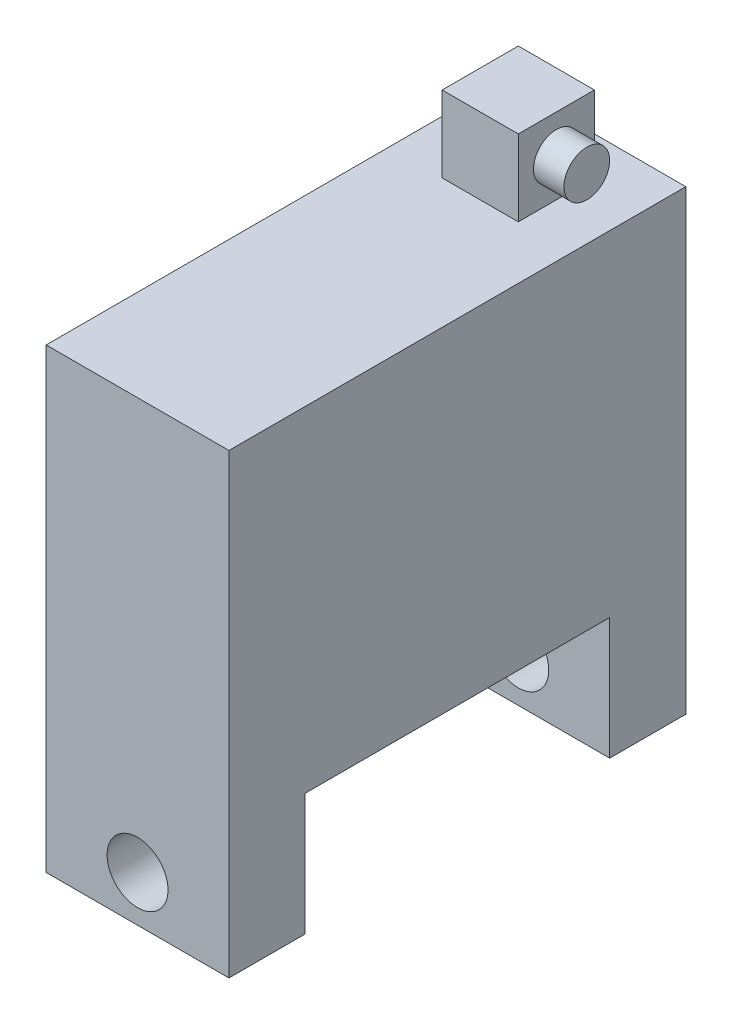
ISO-10303-21;
HEADER;
FILE_DESCRIPTION(('STEP AP214'),'2;1');
FILE_NAME('part.step','',(''),(''),'','','');
FILE_SCHEMA(('AUTOMOTIVE_DESIGN { 1 0 10303 214 1 1 1 1 }'));
ENDSEC;
DATA;
#1=APPLICATION_CONTEXT('core data for automotive mechanical design processes');
#2=APPLICATION_PROTOCOL_DEFINITION('international standard','automotive_design',2000,#1);
#3=PRODUCT_CONTEXT('',#1,'mechanical');
#4=PRODUCT('Part','Part','',(#3));
#5=PRODUCT_RELATED_PRODUCT_CATEGORY('part','',(#4));
#6=PRODUCT_DEFINITION_FORMATION('','',#4);
#7=PRODUCT_DEFINITION_CONTEXT('part definition',#1,'design');
#8=PRODUCT_DEFINITION('design','',#6,#7);
#9=PRODUCT_DEFINITION_SHAPE('','',#8);
#10=(LENGTH_UNIT() NAMED_UNIT(*) SI_UNIT(.MILLI.,.METRE.));
#11=(NAMED_UNIT(*) PLANE_ANGLE_UNIT() SI_UNIT($,.RADIAN.));
#12=(NAMED_UNIT(*) SI_UNIT($,.STERADIAN.) SOLID_ANGLE_UNIT());
#13=UNCERTAINTY_MEASURE_WITH_UNIT(LENGTH_MEASURE(1.E-05),#10,'distance_accuracy_value','');
#14=(GEOMETRIC_REPRESENTATION_CONTEXT(3) GLOBAL_UNCERTAINTY_ASSIGNED_CONTEXT((#13)) GLOBAL_UNIT_ASSIGNED_CONTEXT((#10,
#11,#12)) REPRESENTATION_CONTEXT('',''));
#15=CARTESIAN_POINT('',(0.,0.,0.));
#16=DIRECTION('',(0.,0.,1.));
#17=DIRECTION('',(1.,0.,0.));
#18=AXIS2_PLACEMENT_3D('',#15,#16,#17);
#19=CARTESIAN_POINT('',(0.,150.,0.));
#20=DIRECTION('',(0.,-1.,0.));
#21=DIRECTION('',(0.,0.,-1.));
#22=AXIS2_PLACEMENT_3D('',#19,#20,#21);
#23=PLANE('',#22);
#24=DIRECTION('',(1.,0.,0.));
#25=VECTOR('',#24,1.);
#26=CARTESIAN_POINT('',(-30.,150.,75.));
#27=LINE('',#26,#25);
#28=CARTESIAN_POINT('',(-30.,150.,75.));
#29=VERTEX_POINT('',#28);
#30=CARTESIAN_POINT('',(30.,150.,75.));
#31=VERTEX_POINT('',#30);
#32=EDGE_CURVE('E184',#29,#31,#27,.T.);
#33=ORIENTED_EDGE('',*,*,#32,.T.);
#34=DIRECTION('',(0.,0.,1.));
#35=VECTOR('',#34,1.);
#36=CARTESIAN_POINT('',(30.,150.,-75.));
#37=LINE('',#36,#35);
#38=CARTESIAN_POINT('',(30.,150.,-75.));
#39=VERTEX_POINT('',#38);
#40=EDGE_CURVE('E186',#39,#31,#37,.T.);
#41=ORIENTED_EDGE('',*,*,#40,.F.);
#42=DIRECTION('',(1.,0.,0.));
#43=VECTOR('',#42,1.);
#44=CARTESIAN_POINT('',(-30.,150.,-75.));
#45=LINE('',#44,#43);
#46=CARTESIAN_POINT('',(-30.,150.,-75.));
#47=VERTEX_POINT('',#46);
#48=EDGE_CURVE('E190',#47,#39,#45,.T.);
#49=ORIENTED_EDGE('',*,*,#48,.F.);
#50=DIRECTION('',(0.,0.,1.));
#51=VECTOR('',#50,1.);
#52=CARTESIAN_POINT('',(-30.,150.,-75.));
#53=LINE('',#52,#51);
#54=EDGE_CURVE('E193',#47,#29,#53,.T.);
#55=ORIENTED_EDGE('',*,*,#54,.T.);
#56=EDGE_LOOP('',(#33,#41,#49,#55));
#57=FACE_BOUND('',#56,.T.);
#58=DIRECTION('',(0.,0.,-1.));
#59=VECTOR('',#58,1.);
#60=CARTESIAN_POINT('',(12.5,150.,-62.5));
#61=LINE('',#60,#59);
#62=CARTESIAN_POINT('',(12.5,150.,-37.5));
#63=VERTEX_POINT('',#62);
#64=CARTESIAN_POINT('',(12.5,150.,-62.5));
#65=VERTEX_POINT('',#64);
#66=EDGE_CURVE('E146',#63,#65,#61,.T.);
#67=ORIENTED_EDGE('',*,*,#66,.F.);
#68=DIRECTION('',(1.,0.,0.));
#69=VECTOR('',#68,1.);
#70=CARTESIAN_POINT('',(-12.5,150.,-37.5));
#71=LINE('',#70,#69);
#72=CARTESIAN_POINT('',(-12.5,150.,-37.5));
#73=VERTEX_POINT('',#72);
#74=EDGE_CURVE('E143',#73,#63,#71,.T.);
#75=ORIENTED_EDGE('',*,*,#74,.F.);
#76=DIRECTION('',(0.,0.,1.));
#77=VECTOR('',#76,1.);
#78=CARTESIAN_POINT('',(-12.5,150.,-62.5));
#79=LINE('',#78,#77);
#80=CARTESIAN_POINT('',(-12.5,150.,-62.5));
#81=VERTEX_POINT('',#80);
#82=EDGE_CURVE('E57',#81,#73,#79,.T.);
#83=ORIENTED_EDGE('',*,*,#82,.F.);
#84=DIRECTION('',(-1.,0.,0.));
#85=VECTOR('',#84,1.);
#86=CARTESIAN_POINT('',(-12.5,150.,-62.5));
#87=LINE('',#86,#85);
#88=EDGE_CURVE('E52',#65,#81,#87,.T.);
#89=ORIENTED_EDGE('',*,*,#88,.F.);
#90=EDGE_LOOP('',(#67,#75,#83,#89));
#91=FACE_BOUND('',#90,.T.);
#92=ADVANCED_FACE('F37',(#57,#91),#23,.F.);
#93=CARTESIAN_POINT('',(30.,150.,-75.));
#94=DIRECTION('',(1.,0.,0.));
#95=DIRECTION('',(0.,0.,-1.));
#96=AXIS2_PLACEMENT_3D('',#93,#94,#95);
#97=PLANE('',#96);
#98=DIRECTION('',(0.,0.,-1.));
#99=VECTOR('',#98,1.);
#100=CARTESIAN_POINT('',(30.,40.,-75.));
#101=LINE('',#100,#99);
#102=CARTESIAN_POINT('',(30.,40.,50.));
#103=VERTEX_POINT('',#102);
#104=CARTESIAN_POINT('',(30.,40.,-50.));
#105=VERTEX_POINT('',#104);
#106=EDGE_CURVE('E176',#103,#105,#101,.T.);
#107=ORIENTED_EDGE('',*,*,#106,.T.);
#108=DIRECTION('',(0.,-1.,0.));
#109=VECTOR('',#108,1.);
#110=CARTESIAN_POINT('',(30.,150.,-50.));
#111=LINE('',#110,#109);
#112=CARTESIAN_POINT('',(30.,0.,-50.));
#113=VERTEX_POINT('',#112);
#114=EDGE_CURVE('E173',#105,#113,#111,.T.);
#115=ORIENTED_EDGE('',*,*,#114,.T.);
#116=DIRECTION('',(0.,0.,1.));
#117=VECTOR('',#116,1.);
#118=CARTESIAN_POINT('',(30.,0.,-75.));
#119=LINE('',#118,#117);
#120=CARTESIAN_POINT('',(30.,0.,-75.));
#121=VERTEX_POINT('',#120);
#122=EDGE_CURVE('E199',#121,#113,#119,.T.);
#123=ORIENTED_EDGE('',*,*,#122,.F.);
#124=DIRECTION('',(0.,-1.,0.));
#125=VECTOR('',#124,1.);
#126=CARTESIAN_POINT('',(30.,150.,-75.));
#127=LINE('',#126,#125);
#128=EDGE_CURVE('E212',#39,#121,#127,.T.);
#129=ORIENTED_EDGE('',*,*,#128,.F.);
#130=ORIENTED_EDGE('',*,*,#40,.T.);
#131=DIRECTION('',(0.,-1.,0.));
#132=VECTOR('',#131,1.);
#133=CARTESIAN_POINT('',(30.,150.,75.));
#134=LINE('',#133,#132);
#135=CARTESIAN_POINT('',(30.,0.,75.));
#136=VERTEX_POINT('',#135);
#137=EDGE_CURVE('E214',#31,#136,#134,.T.);
#138=ORIENTED_EDGE('',*,*,#137,.T.);
#139=CARTESIAN_POINT('',(30.,0.,50.));
#140=VERTEX_POINT('',#139);
#141=EDGE_CURVE('E198',#140,#136,#119,.T.);
#142=ORIENTED_EDGE('',*,*,#141,.F.);
#143=DIRECTION('',(0.,1.,0.));
#144=VECTOR('',#143,1.);
#145=CARTESIAN_POINT('',(30.,150.,50.));
#146=LINE('',#145,#144);
#147=EDGE_CURVE('E164',#140,#103,#146,.T.);
#148=ORIENTED_EDGE('',*,*,#147,.T.);
#149=EDGE_LOOP('',(#107,#115,#123,#129,#130,#138,#142,#148));
#150=FACE_BOUND('',#149,.T.);
#151=ADVANCED_FACE('F244',(#150),#97,.T.);
#152=CARTESIAN_POINT('',(-30.,150.,-75.));
#153=DIRECTION('',(1.,0.,0.));
#154=DIRECTION('',(0.,0.,-1.));
#155=AXIS2_PLACEMENT_3D('',#152,#153,#154);
#156=PLANE('',#155);
#157=DIRECTION('',(0.,-1.,0.));
#158=VECTOR('',#157,1.);
#159=CARTESIAN_POINT('',(-30.,150.,-50.));
#160=LINE('',#159,#158);
#161=CARTESIAN_POINT('',(-30.,40.,-50.));
#162=VERTEX_POINT('',#161);
#163=CARTESIAN_POINT('',(-30.,0.,-50.));
#164=VERTEX_POINT('',#163);
#165=EDGE_CURVE('E171',#162,#164,#160,.T.);
#166=ORIENTED_EDGE('',*,*,#165,.F.);
#167=DIRECTION('',(0.,0.,-1.));
#168=VECTOR('',#167,1.);
#169=CARTESIAN_POINT('',(-30.,40.,-75.));
#170=LINE('',#169,#168);
#171=CARTESIAN_POINT('',(-30.,40.,50.));
#172=VERTEX_POINT('',#171);
#173=EDGE_CURVE('E45',#172,#162,#170,.T.);
#174=ORIENTED_EDGE('',*,*,#173,.F.);
#175=DIRECTION('',(0.,1.,0.));
#176=VECTOR('',#175,1.);
#177=CARTESIAN_POINT('',(-30.,150.,50.));
#178=LINE('',#177,#176);
#179=CARTESIAN_POINT('',(-30.,0.,50.));
#180=VERTEX_POINT('',#179);
#181=EDGE_CURVE('E162',#180,#172,#178,.T.);
#182=ORIENTED_EDGE('',*,*,#181,.F.);
#183=DIRECTION('',(0.,0.,1.));
#184=VECTOR('',#183,1.);
#185=CARTESIAN_POINT('',(-30.,0.,-75.));
#186=LINE('',#185,#184);
#187=CARTESIAN_POINT('',(-30.,0.,75.));
#188=VERTEX_POINT('',#187);
#189=EDGE_CURVE('E205',#180,#188,#186,.T.);
#190=ORIENTED_EDGE('',*,*,#189,.T.);
#191=DIRECTION('',(0.,-1.,0.));
#192=VECTOR('',#191,1.);
#193=CARTESIAN_POINT('',(-30.,150.,75.));
#194=LINE('',#193,#192);
#195=EDGE_CURVE('E195',#29,#188,#194,.T.);
#196=ORIENTED_EDGE('',*,*,#195,.F.);
#197=ORIENTED_EDGE('',*,*,#54,.F.);
#198=DIRECTION('',(0.,-1.,0.));
#199=VECTOR('',#198,1.);
#200=CARTESIAN_POINT('',(-30.,150.,-75.));
#201=LINE('',#200,#199);
#202=CARTESIAN_POINT('',(-30.,0.,-75.));
#203=VERTEX_POINT('',#202);
#204=EDGE_CURVE('E210',#47,#203,#201,.T.);
#205=ORIENTED_EDGE('',*,*,#204,.T.);
#206=EDGE_CURVE('E187',#203,#164,#186,.T.);
#207=ORIENTED_EDGE('',*,*,#206,.T.);
#208=EDGE_LOOP('',(#166,#174,#182,#190,#196,#197,#205,#207));
#209=FACE_BOUND('',#208,.T.);
#210=ADVANCED_FACE('F232',(#209),#156,.F.);
#211=CARTESIAN_POINT('',(0.,0.,0.));
#212=DIRECTION('',(0.,-1.,0.));
#213=DIRECTION('',(0.,0.,-1.));
#214=AXIS2_PLACEMENT_3D('',#211,#212,#213);
#215=PLANE('',#214);
#216=ORIENTED_EDGE('',*,*,#122,.T.);
#217=DIRECTION('',(-1.,0.,0.));
#218=VECTOR('',#217,1.);
#219=CARTESIAN_POINT('',(0.,0.,-50.));
#220=LINE('',#219,#218);
#221=EDGE_CURVE('E168',#113,#164,#220,.T.);
#222=ORIENTED_EDGE('',*,*,#221,.T.);
#223=ORIENTED_EDGE('',*,*,#206,.F.);
#224=DIRECTION('',(1.,0.,0.));
#225=VECTOR('',#224,1.);
#226=CARTESIAN_POINT('',(-30.,0.,-75.));
#227=LINE('',#226,#225);
#228=EDGE_CURVE('E202',#203,#121,#227,.T.);
#229=ORIENTED_EDGE('',*,*,#228,.T.);
#230=EDGE_LOOP('',(#216,#222,#223,#229));
#231=FACE_BOUND('',#230,.T.);
#232=ADVANCED_FACE('F237',(#231),#215,.T.);
#233=ORIENTED_EDGE('',*,*,#189,.F.);
#234=DIRECTION('',(1.,0.,0.));
#235=VECTOR('',#234,1.);
#236=CARTESIAN_POINT('',(0.,0.,50.));
#237=LINE('',#236,#235);
#238=EDGE_CURVE('E159',#180,#140,#237,.T.);
#239=ORIENTED_EDGE('',*,*,#238,.T.);
#240=ORIENTED_EDGE('',*,*,#141,.T.);
#241=DIRECTION('',(1.,0.,0.));
#242=VECTOR('',#241,1.);
#243=CARTESIAN_POINT('',(-30.,0.,75.));
#244=LINE('',#243,#242);
#245=EDGE_CURVE('E183',#188,#136,#244,.T.);
#246=ORIENTED_EDGE('',*,*,#245,.F.);
#247=EDGE_LOOP('',(#233,#239,#240,#246));
#248=FACE_BOUND('',#247,.T.);
#249=ADVANCED_FACE('F253',(#248),#215,.T.);
#250=CARTESIAN_POINT('',(0.,15.,100.));
#251=DIRECTION('',(0.,0.,-1.));
#252=DIRECTION('',(-1.,0.,0.));
#253=AXIS2_PLACEMENT_3D('',#250,#251,#252);
#254=CYLINDRICAL_SURFACE('',#253,10.);
#255=CARTESIAN_POINT('',(0.,15.,-75.));
#256=DIRECTION('',(0.,0.,-1.));
#257=DIRECTION('',(-1.,0.,0.));
#258=AXIS2_PLACEMENT_3D('',#255,#256,#257);
#259=CIRCLE('',#258,10.);
#260=CARTESIAN_POINT('',(-10.,15.,-75.));
#261=VERTEX_POINT('',#260);
#262=EDGE_CURVE('E179',#261,#261,#259,.F.);
#263=ORIENTED_EDGE('',*,*,#262,.F.);
#264=EDGE_LOOP('',(#263));
#265=FACE_BOUND('',#264,.T.);
#266=CARTESIAN_POINT('',(0.,15.,-50.));
#267=DIRECTION('',(0.,0.,1.));
#268=DIRECTION('',(1.,0.,0.));
#269=AXIS2_PLACEMENT_3D('',#266,#267,#268);
#270=CIRCLE('',#269,10.);
#271=CARTESIAN_POINT('',(10.,15.,-50.));
#272=VERTEX_POINT('',#271);
#273=EDGE_CURVE('E167',#272,#272,#270,.T.);
#274=ORIENTED_EDGE('',*,*,#273,.T.);
#275=EDGE_LOOP('',(#274));
#276=FACE_BOUND('',#275,.T.);
#277=ADVANCED_FACE('F302',(#265,#276),#254,.F.);
#278=CARTESIAN_POINT('',(0.,15.,75.));
#279=DIRECTION('',(0.,0.,-1.));
#280=DIRECTION('',(-1.,0.,0.));
#281=AXIS2_PLACEMENT_3D('',#278,#279,#280);
#282=CIRCLE('',#281,10.);
#283=CARTESIAN_POINT('',(-10.,15.,75.));
#284=VERTEX_POINT('',#283);
#285=EDGE_CURVE('E180',#284,#284,#282,.F.);
#286=ORIENTED_EDGE('',*,*,#285,.T.);
#287=EDGE_LOOP('',(#286));
#288=FACE_BOUND('',#287,.T.);
#289=CARTESIAN_POINT('',(0.,15.,50.));
#290=DIRECTION('',(0.,0.,-1.));
#291=DIRECTION('',(-1.,0.,0.));
#292=AXIS2_PLACEMENT_3D('',#289,#290,#291);
#293=CIRCLE('',#292,10.);
#294=CARTESIAN_POINT('',(-10.,15.,50.));
#295=VERTEX_POINT('',#294);
#296=EDGE_CURVE('E158',#295,#295,#293,.T.);
#297=ORIENTED_EDGE('',*,*,#296,.T.);
#298=EDGE_LOOP('',(#297));
#299=FACE_BOUND('',#298,.T.);
#300=ADVANCED_FACE('F304',(#288,#299),#254,.F.);
#301=CARTESIAN_POINT('',(-30.,150.,75.));
#302=DIRECTION('',(0.,0.,-1.));
#303=DIRECTION('',(-1.,0.,0.));
#304=AXIS2_PLACEMENT_3D('',#301,#302,#303);
#305=PLANE('',#304);
#306=ORIENTED_EDGE('',*,*,#285,.F.);
#307=EDGE_LOOP('',(#306));
#308=FACE_BOUND('',#307,.T.);
#309=ORIENTED_EDGE('',*,*,#245,.T.);
#310=ORIENTED_EDGE('',*,*,#137,.F.);
#311=ORIENTED_EDGE('',*,*,#32,.F.);
#312=ORIENTED_EDGE('',*,*,#195,.T.);
#313=EDGE_LOOP('',(#309,#310,#311,#312));
#314=FACE_BOUND('',#313,.T.);
#315=ADVANCED_FACE('F39',(#308,#314),#305,.F.);
#316=CARTESIAN_POINT('',(-30.,150.,-75.));
#317=DIRECTION('',(0.,0.,-1.));
#318=DIRECTION('',(-1.,0.,0.));
#319=AXIS2_PLACEMENT_3D('',#316,#317,#318);
#320=PLANE('',#319);
#321=ORIENTED_EDGE('',*,*,#262,.T.);
#322=EDGE_LOOP('',(#321));
#323=FACE_BOUND('',#322,.T.);
#324=ORIENTED_EDGE('',*,*,#228,.F.);
#325=ORIENTED_EDGE('',*,*,#204,.F.);
#326=ORIENTED_EDGE('',*,*,#48,.T.);
#327=ORIENTED_EDGE('',*,*,#128,.T.);
#328=EDGE_LOOP('',(#324,#325,#326,#327));
#329=FACE_BOUND('',#328,.T.);
#330=ADVANCED_FACE('F239',(#323,#329),#320,.T.);
#331=CARTESIAN_POINT('',(100.,40.,50.));
#332=DIRECTION('',(0.,-1.,0.));
#333=DIRECTION('',(0.,0.,-1.));
#334=AXIS2_PLACEMENT_3D('',#331,#332,#333);
#335=PLANE('',#334);
#336=DIRECTION('',(-1.,0.,0.));
#337=VECTOR('',#336,1.);
#338=CARTESIAN_POINT('',(100.,40.,50.));
#339=LINE('',#338,#337);
#340=EDGE_CURVE('E147',#103,#172,#339,.T.);
#341=ORIENTED_EDGE('',*,*,#340,.T.);
#342=ORIENTED_EDGE('',*,*,#173,.T.);
#343=DIRECTION('',(-1.,0.,0.));
#344=VECTOR('',#343,1.);
#345=CARTESIAN_POINT('',(100.,40.,-50.));
#346=LINE('',#345,#344);
#347=EDGE_CURVE('E150',#105,#162,#346,.T.);
#348=ORIENTED_EDGE('',*,*,#347,.F.);
#349=ORIENTED_EDGE('',*,*,#106,.F.);
#350=EDGE_LOOP('',(#341,#342,#348,#349));
#351=FACE_BOUND('',#350,.T.);
#352=ADVANCED_FACE('F225',(#351),#335,.T.);
#353=CARTESIAN_POINT('',(100.,-40.,-50.));
#354=DIRECTION('',(0.,0.,1.));
#355=DIRECTION('',(1.,0.,0.));
#356=AXIS2_PLACEMENT_3D('',#353,#354,#355);
#357=PLANE('',#356);
#358=ORIENTED_EDGE('',*,*,#273,.F.);
#359=EDGE_LOOP('',(#358));
#360=FACE_BOUND('',#359,.T.);
#361=ORIENTED_EDGE('',*,*,#347,.T.);
#362=ORIENTED_EDGE('',*,*,#165,.T.);
#363=ORIENTED_EDGE('',*,*,#221,.F.);
#364=ORIENTED_EDGE('',*,*,#114,.F.);
#365=EDGE_LOOP('',(#361,#362,#363,#364));
#366=FACE_BOUND('',#365,.T.);
#367=ADVANCED_FACE('F231',(#360,#366),#357,.T.);
#368=CARTESIAN_POINT('',(100.,-40.,50.));
#369=DIRECTION('',(0.,0.,-1.));
#370=DIRECTION('',(-1.,0.,0.));
#371=AXIS2_PLACEMENT_3D('',#368,#369,#370);
#372=PLANE('',#371);
#373=ORIENTED_EDGE('',*,*,#238,.F.);
#374=ORIENTED_EDGE('',*,*,#181,.T.);
#375=ORIENTED_EDGE('',*,*,#340,.F.);
#376=ORIENTED_EDGE('',*,*,#147,.F.);
#377=EDGE_LOOP('',(#373,#374,#375,#376));
#378=FACE_BOUND('',#377,.T.);
#379=ORIENTED_EDGE('',*,*,#296,.F.);
#380=EDGE_LOOP('',(#379));
#381=FACE_BOUND('',#380,.T.);
#382=ADVANCED_FACE('F247',(#378,#381),#372,.T.);
#383=CARTESIAN_POINT('',(12.5,175.,-62.5));
#384=DIRECTION('',(-1.,0.,0.));
#385=DIRECTION('',(0.,0.,1.));
#386=AXIS2_PLACEMENT_3D('',#383,#384,#385);
#387=PLANE('',#386);
#388=CARTESIAN_POINT('',(12.5,162.5,-50.));
#389=DIRECTION('',(-1.,0.,0.));
#390=DIRECTION('',(0.,0.,1.));
#391=AXIS2_PLACEMENT_3D('',#388,#389,#390);
#392=CIRCLE('',#391,7.5);
#393=CARTESIAN_POINT('',(12.5,162.5,-42.5));
#394=VERTEX_POINT('',#393);
#395=EDGE_CURVE('E11',#394,#394,#392,.F.);
#396=ORIENTED_EDGE('',*,*,#395,.F.);
#397=EDGE_LOOP('',(#396));
#398=FACE_BOUND('',#397,.T.);
#399=ORIENTED_EDGE('',*,*,#66,.T.);
#400=DIRECTION('',(0.,-1.,0.));
#401=VECTOR('',#400,1.);
#402=CARTESIAN_POINT('',(12.5,175.,-62.5));
#403=LINE('',#402,#401);
#404=CARTESIAN_POINT('',(12.5,175.,-62.5));
#405=VERTEX_POINT('',#404);
#406=EDGE_CURVE('E127',#405,#65,#403,.T.);
#407=ORIENTED_EDGE('',*,*,#406,.F.);
#408=DIRECTION('',(0.,0.,-1.));
#409=VECTOR('',#408,1.);
#410=CARTESIAN_POINT('',(12.5,175.,-62.5));
#411=LINE('',#410,#409);
#412=CARTESIAN_POINT('',(12.5,175.,-37.5));
#413=VERTEX_POINT('',#412);
#414=EDGE_CURVE('E134',#413,#405,#411,.T.);
#415=ORIENTED_EDGE('',*,*,#414,.F.);
#416=DIRECTION('',(0.,-1.,0.));
#417=VECTOR('',#416,1.);
#418=CARTESIAN_POINT('',(12.5,175.,-37.5));
#419=LINE('',#418,#417);
#420=EDGE_CURVE('E266',#413,#63,#419,.T.);
#421=ORIENTED_EDGE('',*,*,#420,.T.);
#422=EDGE_LOOP('',(#399,#407,#415,#421));
#423=FACE_BOUND('',#422,.T.);
#424=ADVANCED_FACE('F145',(#398,#423),#387,.F.);
#425=CARTESIAN_POINT('',(-12.5,175.,-62.5));
#426=DIRECTION('',(0.,0.,1.));
#427=DIRECTION('',(1.,0.,0.));
#428=AXIS2_PLACEMENT_3D('',#425,#426,#427);
#429=PLANE('',#428);
#430=ORIENTED_EDGE('',*,*,#88,.T.);
#431=DIRECTION('',(0.,-1.,0.));
#432=VECTOR('',#431,1.);
#433=CARTESIAN_POINT('',(-12.5,175.,-62.5));
#434=LINE('',#433,#432);
#435=CARTESIAN_POINT('',(-12.5,175.,-62.5));
#436=VERTEX_POINT('',#435);
#437=EDGE_CURVE('E130',#436,#81,#434,.T.);
#438=ORIENTED_EDGE('',*,*,#437,.F.);
#439=DIRECTION('',(-1.,0.,0.));
#440=VECTOR('',#439,1.);
#441=CARTESIAN_POINT('',(-12.5,175.,-62.5));
#442=LINE('',#441,#440);
#443=EDGE_CURVE('E123',#405,#436,#442,.T.);
#444=ORIENTED_EDGE('',*,*,#443,.F.);
#445=ORIENTED_EDGE('',*,*,#406,.T.);
#446=EDGE_LOOP('',(#430,#438,#444,#445));
#447=FACE_BOUND('',#446,.T.);
#448=ADVANCED_FACE('F125',(#447),#429,.F.);
#449=CARTESIAN_POINT('',(-12.5,175.,-62.5));
#450=DIRECTION('',(1.,0.,0.));
#451=DIRECTION('',(0.,0.,-1.));
#452=AXIS2_PLACEMENT_3D('',#449,#450,#451);
#453=PLANE('',#452);
#454=ORIENTED_EDGE('',*,*,#82,.T.);
#455=DIRECTION('',(0.,-1.,0.));
#456=VECTOR('',#455,1.);
#457=CARTESIAN_POINT('',(-12.5,175.,-37.5));
#458=LINE('',#457,#456);
#459=CARTESIAN_POINT('',(-12.5,175.,-37.5));
#460=VERTEX_POINT('',#459);
#461=EDGE_CURVE('E152',#460,#73,#458,.T.);
#462=ORIENTED_EDGE('',*,*,#461,.F.);
#463=DIRECTION('',(0.,0.,1.));
#464=VECTOR('',#463,1.);
#465=CARTESIAN_POINT('',(-12.5,175.,-62.5));
#466=LINE('',#465,#464);
#467=EDGE_CURVE('E133',#436,#460,#466,.T.);
#468=ORIENTED_EDGE('',*,*,#467,.F.);
#469=ORIENTED_EDGE('',*,*,#437,.T.);
#470=EDGE_LOOP('',(#454,#462,#468,#469));
#471=FACE_BOUND('',#470,.T.);
#472=ADVANCED_FACE('F292',(#471),#453,.F.);
#473=CARTESIAN_POINT('',(-12.5,175.,-37.5));
#474=DIRECTION('',(0.,0.,-1.));
#475=DIRECTION('',(-1.,0.,0.));
#476=AXIS2_PLACEMENT_3D('',#473,#474,#475);
#477=PLANE('',#476);
#478=ORIENTED_EDGE('',*,*,#74,.T.);
#479=ORIENTED_EDGE('',*,*,#420,.F.);
#480=DIRECTION('',(1.,0.,0.));
#481=VECTOR('',#480,1.);
#482=CARTESIAN_POINT('',(-12.5,175.,-37.5));
#483=LINE('',#482,#481);
#484=EDGE_CURVE('E139',#460,#413,#483,.T.);
#485=ORIENTED_EDGE('',*,*,#484,.F.);
#486=ORIENTED_EDGE('',*,*,#461,.T.);
#487=EDGE_LOOP('',(#478,#479,#485,#486));
#488=FACE_BOUND('',#487,.T.);
#489=ADVANCED_FACE('F265',(#488),#477,.F.);
#490=CARTESIAN_POINT('',(0.,175.,0.));
#491=DIRECTION('',(0.,1.,0.));
#492=DIRECTION('',(0.,0.,1.));
#493=AXIS2_PLACEMENT_3D('',#490,#491,#492);
#494=PLANE('',#493);
#495=ORIENTED_EDGE('',*,*,#414,.T.);
#496=ORIENTED_EDGE('',*,*,#443,.T.);
#497=ORIENTED_EDGE('',*,*,#467,.T.);
#498=ORIENTED_EDGE('',*,*,#484,.T.);
#499=EDGE_LOOP('',(#495,#496,#497,#498));
#500=FACE_BOUND('',#499,.T.);
#501=ADVANCED_FACE('F137',(#500),#494,.T.);
#502=CARTESIAN_POINT('',(22.5,162.5,-50.));
#503=DIRECTION('',(-1.,0.,0.));
#504=DIRECTION('',(0.,0.,1.));
#505=AXIS2_PLACEMENT_3D('',#502,#503,#504);
#506=CYLINDRICAL_SURFACE('',#505,7.5);
#507=CARTESIAN_POINT('',(22.5,162.5,-50.));
#508=DIRECTION('',(1.,0.,0.));
#509=DIRECTION('',(0.,0.,-1.));
#510=AXIS2_PLACEMENT_3D('',#507,#508,#509);
#511=CIRCLE('',#510,7.5);
#512=CARTESIAN_POINT('',(22.5,162.5,-57.5));
#513=VERTEX_POINT('',#512);
#514=EDGE_CURVE('E261',#513,#513,#511,.T.);
#515=ORIENTED_EDGE('',*,*,#514,.F.);
#516=EDGE_LOOP('',(#515));
#517=FACE_BOUND('',#516,.T.);
#518=ORIENTED_EDGE('',*,*,#395,.T.);
#519=EDGE_LOOP('',(#518));
#520=FACE_BOUND('',#519,.T.);
#521=ADVANCED_FACE('F280',(#517,#520),#506,.T.);
#522=CARTESIAN_POINT('',(22.5,162.5,-50.));
#523=DIRECTION('',(1.,0.,0.));
#524=DIRECTION('',(0.,0.,-1.));
#525=AXIS2_PLACEMENT_3D('',#522,#523,#524);
#526=PLANE('',#525);
#527=ORIENTED_EDGE('',*,*,#514,.T.);
#528=EDGE_LOOP('',(#527));
#529=FACE_BOUND('',#528,.T.);
#530=ADVANCED_FACE('F278',(#529),#526,.T.);
#531=CLOSED_SHELL('',(#92,#151,#210,#232,#249,#277,#300,#315,#330,#352,#367,#382,#424,#448,#472,
#489,#501,#521,#530));
#532=MANIFOLD_SOLID_BREP('B2',#531);
#533=ADVANCED_BREP_SHAPE_REPRESENTATION('',(#18,#532),#14);
#534=SHAPE_DEFINITION_REPRESENTATION(#9,#533);
ENDSEC;
END-ISO-10303-21;
